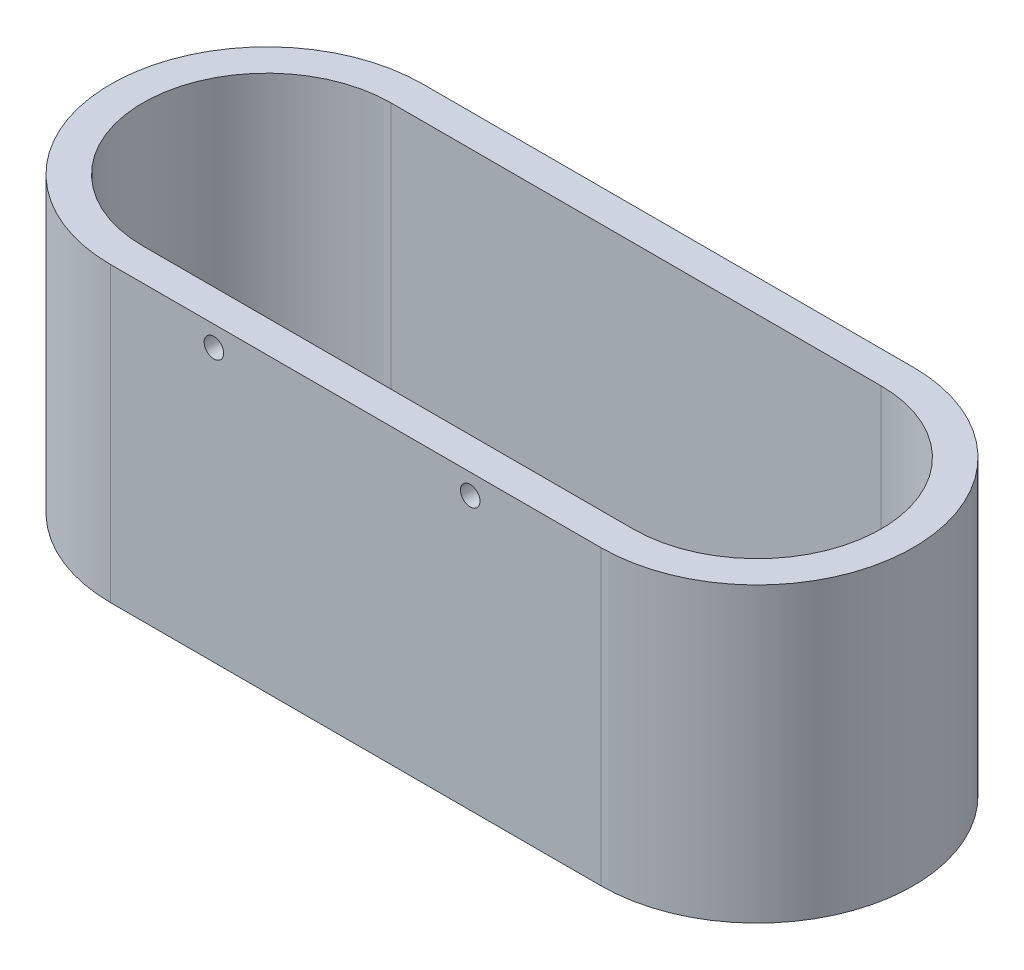
ISO-10303-21;
HEADER;
FILE_DESCRIPTION(('STEP AP214'),'2;1');
FILE_NAME('part.step','',(''),(''),'','','');
FILE_SCHEMA(('AUTOMOTIVE_DESIGN { 1 0 10303 214 1 1 1 1 }'));
ENDSEC;
DATA;
#1=APPLICATION_CONTEXT('core data for automotive mechanical design processes');
#2=APPLICATION_PROTOCOL_DEFINITION('international standard','automotive_design',2000,#1);
#3=PRODUCT_CONTEXT('',#1,'mechanical');
#4=PRODUCT('Part','Part','',(#3));
#5=PRODUCT_RELATED_PRODUCT_CATEGORY('part','',(#4));
#6=PRODUCT_DEFINITION_FORMATION('','',#4);
#7=PRODUCT_DEFINITION_CONTEXT('part definition',#1,'design');
#8=PRODUCT_DEFINITION('design','',#6,#7);
#9=PRODUCT_DEFINITION_SHAPE('','',#8);
#10=(LENGTH_UNIT() NAMED_UNIT(*) SI_UNIT(.MILLI.,.METRE.));
#11=(NAMED_UNIT(*) PLANE_ANGLE_UNIT() SI_UNIT($,.RADIAN.));
#12=(NAMED_UNIT(*) SI_UNIT($,.STERADIAN.) SOLID_ANGLE_UNIT());
#13=UNCERTAINTY_MEASURE_WITH_UNIT(LENGTH_MEASURE(1.E-05),#10,'distance_accuracy_value','');
#14=(GEOMETRIC_REPRESENTATION_CONTEXT(3) GLOBAL_UNCERTAINTY_ASSIGNED_CONTEXT((#13)) GLOBAL_UNIT_ASSIGNED_CONTEXT((#10,
#11,#12)) REPRESENTATION_CONTEXT('',''));
#15=CARTESIAN_POINT('',(0.,0.,0.));
#16=DIRECTION('',(0.,0.,1.));
#17=DIRECTION('',(1.,0.,0.));
#18=AXIS2_PLACEMENT_3D('',#15,#16,#17);
#19=CARTESIAN_POINT('',(0.,30.,16.));
#20=DIRECTION('',(0.,0.,-1.));
#21=DIRECTION('',(-1.,0.,0.));
#22=AXIS2_PLACEMENT_3D('',#19,#20,#21);
#23=PLANE('',#22);
#24=CARTESIAN_POINT('',(-15.2613055483738,27.9149585524294,16.));
#25=DIRECTION('',(0.,0.,1.));
#26=DIRECTION('',(1.,0.,0.));
#27=AXIS2_PLACEMENT_3D('',#24,#25,#26);
#28=CIRCLE('',#27,1.);
#29=CARTESIAN_POINT('',(-14.2613055483738,27.9149585524294,16.));
#30=VERTEX_POINT('',#29);
#31=EDGE_CURVE('E218',#30,#30,#28,.T.);
#32=ORIENTED_EDGE('',*,*,#31,.F.);
#33=EDGE_LOOP('',(#32));
#34=FACE_BOUND('',#33,.T.);
#35=CARTESIAN_POINT('',(10.9965215882747,27.9149585524294,16.));
#36=DIRECTION('',(0.,0.,1.));
#37=DIRECTION('',(1.,0.,0.));
#38=AXIS2_PLACEMENT_3D('',#35,#36,#37);
#39=CIRCLE('',#38,1.);
#40=CARTESIAN_POINT('',(11.9965215882747,27.9149585524294,16.));
#41=VERTEX_POINT('',#40);
#42=EDGE_CURVE('E210',#41,#41,#39,.T.);
#43=ORIENTED_EDGE('',*,*,#42,.F.);
#44=EDGE_LOOP('',(#43));
#45=FACE_BOUND('',#44,.T.);
#46=DIRECTION('',(1.,0.,0.));
#47=VECTOR('',#46,1.);
#48=CARTESIAN_POINT('',(0.,0.,16.));
#49=LINE('',#48,#47);
#50=CARTESIAN_POINT('',(-25.8381608713955,0.,16.));
#51=VERTEX_POINT('',#50);
#52=CARTESIAN_POINT('',(24.3852243472721,0.,16.));
#53=VERTEX_POINT('',#52);
#54=EDGE_CURVE('E156',#51,#53,#49,.T.);
#55=ORIENTED_EDGE('',*,*,#54,.T.);
#56=DIRECTION('',(0.,-1.,0.));
#57=VECTOR('',#56,1.);
#58=CARTESIAN_POINT('',(24.3852243472721,30.,16.));
#59=LINE('',#58,#57);
#60=CARTESIAN_POINT('',(24.3852243472721,30.,16.));
#61=VERTEX_POINT('',#60);
#62=EDGE_CURVE('E11',#61,#53,#59,.T.);
#63=ORIENTED_EDGE('',*,*,#62,.F.);
#64=DIRECTION('',(1.,0.,0.));
#65=VECTOR('',#64,1.);
#66=CARTESIAN_POINT('',(0.,30.,16.));
#67=LINE('',#66,#65);
#68=CARTESIAN_POINT('',(-25.8381608713955,30.,16.));
#69=VERTEX_POINT('',#68);
#70=EDGE_CURVE('E118',#69,#61,#67,.T.);
#71=ORIENTED_EDGE('',*,*,#70,.F.);
#72=DIRECTION('',(0.,-1.,0.));
#73=VECTOR('',#72,1.);
#74=CARTESIAN_POINT('',(-25.8381608713955,30.,16.));
#75=LINE('',#74,#73);
#76=EDGE_CURVE('E167',#69,#51,#75,.T.);
#77=ORIENTED_EDGE('',*,*,#76,.T.);
#78=EDGE_LOOP('',(#55,#63,#71,#77));
#79=FACE_BOUND('',#78,.T.);
#80=ADVANCED_FACE('F38',(#34,#45,#79),#23,.F.);
#81=CARTESIAN_POINT('',(24.3852243472721,30.,0.));
#82=DIRECTION('',(0.,-1.,0.));
#83=DIRECTION('',(0.,0.,-1.));
#84=AXIS2_PLACEMENT_3D('',#81,#82,#83);
#85=CYLINDRICAL_SURFACE('',#84,16.);
#86=CARTESIAN_POINT('',(24.3852243472721,0.,0.));
#87=DIRECTION('',(0.,1.,0.));
#88=DIRECTION('',(0.,0.,1.));
#89=AXIS2_PLACEMENT_3D('',#86,#87,#88);
#90=CIRCLE('',#89,16.);
#91=CARTESIAN_POINT('',(24.3852243472721,0.,-16.));
#92=VERTEX_POINT('',#91);
#93=EDGE_CURVE('E125',#53,#92,#90,.T.);
#94=ORIENTED_EDGE('',*,*,#93,.T.);
#95=DIRECTION('',(0.,-1.,0.));
#96=VECTOR('',#95,1.);
#97=CARTESIAN_POINT('',(24.3852243472721,30.,-16.));
#98=LINE('',#97,#96);
#99=CARTESIAN_POINT('',(24.3852243472721,30.,-16.));
#100=VERTEX_POINT('',#99);
#101=EDGE_CURVE('E49',#100,#92,#98,.T.);
#102=ORIENTED_EDGE('',*,*,#101,.F.);
#103=CARTESIAN_POINT('',(24.3852243472721,30.,0.));
#104=DIRECTION('',(0.,1.,0.));
#105=DIRECTION('',(0.,0.,1.));
#106=AXIS2_PLACEMENT_3D('',#103,#104,#105);
#107=CIRCLE('',#106,16.);
#108=EDGE_CURVE('E112',#61,#100,#107,.T.);
#109=ORIENTED_EDGE('',*,*,#108,.F.);
#110=ORIENTED_EDGE('',*,*,#62,.T.);
#111=EDGE_LOOP('',(#94,#102,#109,#110));
#112=FACE_BOUND('',#111,.T.);
#113=ADVANCED_FACE('F124',(#112),#85,.T.);
#114=CARTESIAN_POINT('',(0.,30.,-16.));
#115=DIRECTION('',(0.,0.,-1.));
#116=DIRECTION('',(-1.,0.,0.));
#117=AXIS2_PLACEMENT_3D('',#114,#115,#116);
#118=PLANE('',#117);
#119=DIRECTION('',(1.,0.,0.));
#120=VECTOR('',#119,1.);
#121=CARTESIAN_POINT('',(0.,0.,-16.));
#122=LINE('',#121,#120);
#123=CARTESIAN_POINT('',(-25.8381608713955,0.,-16.));
#124=VERTEX_POINT('',#123);
#125=EDGE_CURVE('E162',#124,#92,#122,.T.);
#126=ORIENTED_EDGE('',*,*,#125,.F.);
#127=DIRECTION('',(0.,-1.,0.));
#128=VECTOR('',#127,1.);
#129=CARTESIAN_POINT('',(-25.8381608713955,30.,-16.));
#130=LINE('',#129,#128);
#131=CARTESIAN_POINT('',(-25.8381608713955,30.,-16.));
#132=VERTEX_POINT('',#131);
#133=EDGE_CURVE('E86',#132,#124,#130,.T.);
#134=ORIENTED_EDGE('',*,*,#133,.F.);
#135=DIRECTION('',(1.,0.,0.));
#136=VECTOR('',#135,1.);
#137=CARTESIAN_POINT('',(0.,30.,-16.));
#138=LINE('',#137,#136);
#139=EDGE_CURVE('E116',#132,#100,#138,.T.);
#140=ORIENTED_EDGE('',*,*,#139,.T.);
#141=ORIENTED_EDGE('',*,*,#101,.T.);
#142=EDGE_LOOP('',(#126,#134,#140,#141));
#143=FACE_BOUND('',#142,.T.);
#144=ADVANCED_FACE('F131',(#143),#118,.T.);
#145=CARTESIAN_POINT('',(0.,30.,-12.7));
#146=DIRECTION('',(0.,0.,-1.));
#147=DIRECTION('',(-1.,0.,0.));
#148=AXIS2_PLACEMENT_3D('',#145,#146,#147);
#149=PLANE('',#148);
#150=DIRECTION('',(1.,0.,0.));
#151=VECTOR('',#150,1.);
#152=CARTESIAN_POINT('',(0.,0.,-12.7));
#153=LINE('',#152,#151);
#154=CARTESIAN_POINT('',(-25.8381608713955,0.,-12.7));
#155=VERTEX_POINT('',#154);
#156=CARTESIAN_POINT('',(24.3852243472721,0.,-12.7));
#157=VERTEX_POINT('',#156);
#158=EDGE_CURVE('E139',#155,#157,#153,.T.);
#159=ORIENTED_EDGE('',*,*,#158,.T.);
#160=DIRECTION('',(0.,-1.,0.));
#161=VECTOR('',#160,1.);
#162=CARTESIAN_POINT('',(24.3852243472721,30.,-12.7));
#163=LINE('',#162,#161);
#164=CARTESIAN_POINT('',(24.3852243472721,30.,-12.7));
#165=VERTEX_POINT('',#164);
#166=EDGE_CURVE('E42',#165,#157,#163,.T.);
#167=ORIENTED_EDGE('',*,*,#166,.F.);
#168=DIRECTION('',(1.,0.,0.));
#169=VECTOR('',#168,1.);
#170=CARTESIAN_POINT('',(0.,30.,-12.7));
#171=LINE('',#170,#169);
#172=CARTESIAN_POINT('',(-25.8381608713955,30.,-12.7));
#173=VERTEX_POINT('',#172);
#174=EDGE_CURVE('E98',#173,#165,#171,.T.);
#175=ORIENTED_EDGE('',*,*,#174,.F.);
#176=DIRECTION('',(0.,-1.,0.));
#177=VECTOR('',#176,1.);
#178=CARTESIAN_POINT('',(-25.8381608713955,30.,-12.7));
#179=LINE('',#178,#177);
#180=EDGE_CURVE('E135',#173,#155,#179,.T.);
#181=ORIENTED_EDGE('',*,*,#180,.T.);
#182=EDGE_LOOP('',(#159,#167,#175,#181));
#183=FACE_BOUND('',#182,.T.);
#184=ADVANCED_FACE('F40',(#183),#149,.F.);
#185=CARTESIAN_POINT('',(24.3852243472721,30.,0.));
#186=DIRECTION('',(0.,-1.,0.));
#187=DIRECTION('',(0.,0.,-1.));
#188=AXIS2_PLACEMENT_3D('',#185,#186,#187);
#189=CYLINDRICAL_SURFACE('',#188,12.7);
#190=CARTESIAN_POINT('',(24.3852243472721,0.,0.));
#191=DIRECTION('',(0.,1.,0.));
#192=DIRECTION('',(0.,0.,1.));
#193=AXIS2_PLACEMENT_3D('',#190,#191,#192);
#194=CIRCLE('',#193,12.7);
#195=CARTESIAN_POINT('',(24.3852243472721,0.,12.7));
#196=VERTEX_POINT('',#195);
#197=EDGE_CURVE('E143',#196,#157,#194,.T.);
#198=ORIENTED_EDGE('',*,*,#197,.F.);
#199=DIRECTION('',(0.,-1.,0.));
#200=VECTOR('',#199,1.);
#201=CARTESIAN_POINT('',(24.3852243472721,30.,12.7));
#202=LINE('',#201,#200);
#203=CARTESIAN_POINT('',(24.3852243472721,30.,12.7));
#204=VERTEX_POINT('',#203);
#205=EDGE_CURVE('E176',#204,#196,#202,.T.);
#206=ORIENTED_EDGE('',*,*,#205,.F.);
#207=CARTESIAN_POINT('',(24.3852243472721,30.,0.));
#208=DIRECTION('',(0.,1.,0.));
#209=DIRECTION('',(0.,0.,1.));
#210=AXIS2_PLACEMENT_3D('',#207,#208,#209);
#211=CIRCLE('',#210,12.7);
#212=EDGE_CURVE('E186',#204,#165,#211,.T.);
#213=ORIENTED_EDGE('',*,*,#212,.T.);
#214=ORIENTED_EDGE('',*,*,#166,.T.);
#215=EDGE_LOOP('',(#198,#206,#213,#214));
#216=FACE_BOUND('',#215,.T.);
#217=ADVANCED_FACE('F185',(#216),#189,.F.);
#218=CARTESIAN_POINT('',(0.,30.,12.7));
#219=DIRECTION('',(0.,0.,-1.));
#220=DIRECTION('',(-1.,0.,0.));
#221=AXIS2_PLACEMENT_3D('',#218,#219,#220);
#222=PLANE('',#221);
#223=CARTESIAN_POINT('',(-15.2613055483738,27.9149585524294,12.7));
#224=DIRECTION('',(0.,0.,-1.));
#225=DIRECTION('',(-1.,0.,0.));
#226=AXIS2_PLACEMENT_3D('',#223,#224,#225);
#227=CIRCLE('',#226,1.);
#228=CARTESIAN_POINT('',(-16.2613055483738,27.9149585524294,12.7));
#229=VERTEX_POINT('',#228);
#230=EDGE_CURVE('E144',#229,#229,#227,.F.);
#231=ORIENTED_EDGE('',*,*,#230,.T.);
#232=EDGE_LOOP('',(#231));
#233=FACE_BOUND('',#232,.T.);
#234=CARTESIAN_POINT('',(10.9965215882747,27.9149585524294,12.7));
#235=DIRECTION('',(0.,0.,-1.));
#236=DIRECTION('',(-1.,0.,0.));
#237=AXIS2_PLACEMENT_3D('',#234,#235,#236);
#238=CIRCLE('',#237,1.);
#239=CARTESIAN_POINT('',(9.9965215882747,27.9149585524294,12.7));
#240=VERTEX_POINT('',#239);
#241=EDGE_CURVE('E214',#240,#240,#238,.F.);
#242=ORIENTED_EDGE('',*,*,#241,.T.);
#243=EDGE_LOOP('',(#242));
#244=FACE_BOUND('',#243,.T.);
#245=DIRECTION('',(1.,0.,0.));
#246=VECTOR('',#245,1.);
#247=CARTESIAN_POINT('',(0.,0.,12.7));
#248=LINE('',#247,#246);
#249=CARTESIAN_POINT('',(-25.8381608713955,0.,12.7));
#250=VERTEX_POINT('',#249);
#251=EDGE_CURVE('E148',#250,#196,#248,.T.);
#252=ORIENTED_EDGE('',*,*,#251,.F.);
#253=DIRECTION('',(0.,-1.,0.));
#254=VECTOR('',#253,1.);
#255=CARTESIAN_POINT('',(-25.8381608713955,30.,12.7));
#256=LINE('',#255,#254);
#257=CARTESIAN_POINT('',(-25.8381608713955,30.,12.7));
#258=VERTEX_POINT('',#257);
#259=EDGE_CURVE('E174',#258,#250,#256,.T.);
#260=ORIENTED_EDGE('',*,*,#259,.F.);
#261=DIRECTION('',(1.,0.,0.));
#262=VECTOR('',#261,1.);
#263=CARTESIAN_POINT('',(0.,30.,12.7));
#264=LINE('',#263,#262);
#265=EDGE_CURVE('E195',#258,#204,#264,.T.);
#266=ORIENTED_EDGE('',*,*,#265,.T.);
#267=ORIENTED_EDGE('',*,*,#205,.T.);
#268=EDGE_LOOP('',(#252,#260,#266,#267));
#269=FACE_BOUND('',#268,.T.);
#270=ADVANCED_FACE('F193',(#233,#244,#269),#222,.T.);
#271=CARTESIAN_POINT('',(-25.8381608713955,30.,0.));
#272=DIRECTION('',(0.,-1.,0.));
#273=DIRECTION('',(0.,0.,-1.));
#274=AXIS2_PLACEMENT_3D('',#271,#272,#273);
#275=CYLINDRICAL_SURFACE('',#274,12.7);
#276=CARTESIAN_POINT('',(-25.8381608713955,0.,0.));
#277=DIRECTION('',(0.,1.,0.));
#278=DIRECTION('',(0.,0.,1.));
#279=AXIS2_PLACEMENT_3D('',#276,#277,#278);
#280=CIRCLE('',#279,12.7);
#281=EDGE_CURVE('E152',#155,#250,#280,.T.);
#282=ORIENTED_EDGE('',*,*,#281,.F.);
#283=ORIENTED_EDGE('',*,*,#180,.F.);
#284=CARTESIAN_POINT('',(-25.8381608713955,30.,0.));
#285=DIRECTION('',(0.,1.,0.));
#286=DIRECTION('',(0.,0.,1.));
#287=AXIS2_PLACEMENT_3D('',#284,#285,#286);
#288=CIRCLE('',#287,12.7);
#289=EDGE_CURVE('E198',#173,#258,#288,.T.);
#290=ORIENTED_EDGE('',*,*,#289,.T.);
#291=ORIENTED_EDGE('',*,*,#259,.T.);
#292=EDGE_LOOP('',(#282,#283,#290,#291));
#293=FACE_BOUND('',#292,.T.);
#294=ADVANCED_FACE('F201',(#293),#275,.F.);
#295=CARTESIAN_POINT('',(-25.8381608713955,30.,0.));
#296=DIRECTION('',(0.,-1.,0.));
#297=DIRECTION('',(0.,0.,-1.));
#298=AXIS2_PLACEMENT_3D('',#295,#296,#297);
#299=CYLINDRICAL_SURFACE('',#298,16.);
#300=CARTESIAN_POINT('',(-25.8381608713955,0.,0.));
#301=DIRECTION('',(0.,1.,0.));
#302=DIRECTION('',(0.,0.,1.));
#303=AXIS2_PLACEMENT_3D('',#300,#301,#302);
#304=CIRCLE('',#303,16.);
#305=EDGE_CURVE('E89',#124,#51,#304,.T.);
#306=ORIENTED_EDGE('',*,*,#305,.T.);
#307=ORIENTED_EDGE('',*,*,#76,.F.);
#308=CARTESIAN_POINT('',(-25.8381608713955,30.,0.));
#309=DIRECTION('',(0.,1.,0.));
#310=DIRECTION('',(0.,0.,1.));
#311=AXIS2_PLACEMENT_3D('',#308,#309,#310);
#312=CIRCLE('',#311,16.);
#313=EDGE_CURVE('E58',#132,#69,#312,.T.);
#314=ORIENTED_EDGE('',*,*,#313,.F.);
#315=ORIENTED_EDGE('',*,*,#133,.T.);
#316=EDGE_LOOP('',(#306,#307,#314,#315));
#317=FACE_BOUND('',#316,.T.);
#318=ADVANCED_FACE('F249',(#317),#299,.T.);
#319=CARTESIAN_POINT('',(0.,30.,0.));
#320=DIRECTION('',(0.,1.,0.));
#321=DIRECTION('',(0.,0.,1.));
#322=AXIS2_PLACEMENT_3D('',#319,#320,#321);
#323=PLANE('',#322);
#324=ORIENTED_EDGE('',*,*,#174,.T.);
#325=ORIENTED_EDGE('',*,*,#212,.F.);
#326=ORIENTED_EDGE('',*,*,#265,.F.);
#327=ORIENTED_EDGE('',*,*,#289,.F.);
#328=EDGE_LOOP('',(#324,#325,#326,#327));
#329=FACE_BOUND('',#328,.T.);
#330=ORIENTED_EDGE('',*,*,#70,.T.);
#331=ORIENTED_EDGE('',*,*,#108,.T.);
#332=ORIENTED_EDGE('',*,*,#139,.F.);
#333=ORIENTED_EDGE('',*,*,#313,.T.);
#334=EDGE_LOOP('',(#330,#331,#332,#333));
#335=FACE_BOUND('',#334,.T.);
#336=ADVANCED_FACE('F114',(#329,#335),#323,.T.);
#337=CARTESIAN_POINT('',(0.,0.,0.));
#338=DIRECTION('',(0.,1.,0.));
#339=DIRECTION('',(0.,0.,1.));
#340=AXIS2_PLACEMENT_3D('',#337,#338,#339);
#341=PLANE('',#340);
#342=ORIENTED_EDGE('',*,*,#158,.F.);
#343=ORIENTED_EDGE('',*,*,#281,.T.);
#344=ORIENTED_EDGE('',*,*,#251,.T.);
#345=ORIENTED_EDGE('',*,*,#197,.T.);
#346=EDGE_LOOP('',(#342,#343,#344,#345));
#347=FACE_BOUND('',#346,.T.);
#348=ORIENTED_EDGE('',*,*,#54,.F.);
#349=ORIENTED_EDGE('',*,*,#305,.F.);
#350=ORIENTED_EDGE('',*,*,#125,.T.);
#351=ORIENTED_EDGE('',*,*,#93,.F.);
#352=EDGE_LOOP('',(#348,#349,#350,#351));
#353=FACE_BOUND('',#352,.T.);
#354=ADVANCED_FACE('F191',(#347,#353),#341,.F.);
#355=CARTESIAN_POINT('',(10.9965215882747,27.9149585524294,-16.001));
#356=DIRECTION('',(0.,0.,1.));
#357=DIRECTION('',(1.,0.,0.));
#358=AXIS2_PLACEMENT_3D('',#355,#356,#357);
#359=CYLINDRICAL_SURFACE('',#358,1.);
#360=ORIENTED_EDGE('',*,*,#241,.F.);
#361=EDGE_LOOP('',(#360));
#362=FACE_BOUND('',#361,.T.);
#363=ORIENTED_EDGE('',*,*,#42,.T.);
#364=EDGE_LOOP('',(#363));
#365=FACE_BOUND('',#364,.T.);
#366=ADVANCED_FACE('F231',(#362,#365),#359,.F.);
#367=CARTESIAN_POINT('',(-15.2613055483738,27.9149585524294,-16.001));
#368=DIRECTION('',(0.,0.,1.));
#369=DIRECTION('',(1.,0.,0.));
#370=AXIS2_PLACEMENT_3D('',#367,#368,#369);
#371=CYLINDRICAL_SURFACE('',#370,1.);
#372=ORIENTED_EDGE('',*,*,#230,.F.);
#373=EDGE_LOOP('',(#372));
#374=FACE_BOUND('',#373,.T.);
#375=ORIENTED_EDGE('',*,*,#31,.T.);
#376=EDGE_LOOP('',(#375));
#377=FACE_BOUND('',#376,.T.);
#378=ADVANCED_FACE('F228',(#374,#377),#371,.F.);
#379=CLOSED_SHELL('',(#80,#113,#144,#184,#217,#270,#294,#318,#336,#354,#366,#378));
#380=MANIFOLD_SOLID_BREP('B2',#379);
#381=ADVANCED_BREP_SHAPE_REPRESENTATION('',(#18,#380),#14);
#382=SHAPE_DEFINITION_REPRESENTATION(#9,#381);
ENDSEC;
END-ISO-10303-21;
